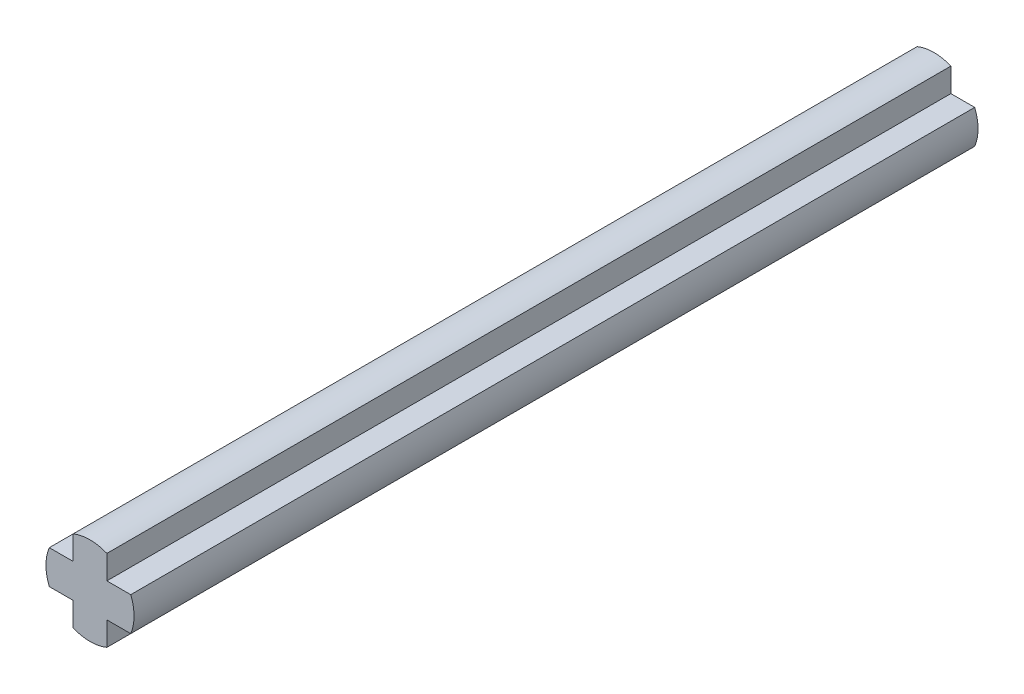
ISO-10303-21;
HEADER;
FILE_DESCRIPTION(('STEP AP214'),'2;1');
FILE_NAME('part.step','',(''),(''),'','','');
FILE_SCHEMA(('AUTOMOTIVE_DESIGN { 1 0 10303 214 1 1 1 1 }'));
ENDSEC;
DATA;
#1=APPLICATION_CONTEXT('core data for automotive mechanical design processes');
#2=APPLICATION_PROTOCOL_DEFINITION('international standard','automotive_design',2000,#1);
#3=PRODUCT_CONTEXT('',#1,'mechanical');
#4=PRODUCT('Part','Part','',(#3));
#5=PRODUCT_RELATED_PRODUCT_CATEGORY('part','',(#4));
#6=PRODUCT_DEFINITION_FORMATION('','',#4);
#7=PRODUCT_DEFINITION_CONTEXT('part definition',#1,'design');
#8=PRODUCT_DEFINITION('design','',#6,#7);
#9=PRODUCT_DEFINITION_SHAPE('','',#8);
#10=(LENGTH_UNIT() NAMED_UNIT(*) SI_UNIT(.MILLI.,.METRE.));
#11=(NAMED_UNIT(*) PLANE_ANGLE_UNIT() SI_UNIT($,.RADIAN.));
#12=(NAMED_UNIT(*) SI_UNIT($,.STERADIAN.) SOLID_ANGLE_UNIT());
#13=UNCERTAINTY_MEASURE_WITH_UNIT(LENGTH_MEASURE(1.E-05),#10,'distance_accuracy_value','');
#14=(GEOMETRIC_REPRESENTATION_CONTEXT(3) GLOBAL_UNCERTAINTY_ASSIGNED_CONTEXT((#13)) GLOBAL_UNIT_ASSIGNED_CONTEXT((#10,
#11,#12)) REPRESENTATION_CONTEXT('',''));
#15=CARTESIAN_POINT('',(0.,0.,0.));
#16=DIRECTION('',(0.,0.,1.));
#17=DIRECTION('',(1.,0.,0.));
#18=AXIS2_PLACEMENT_3D('',#15,#16,#17);
#19=CARTESIAN_POINT('',(-2.17082933460924,0.9,45.));
#20=DIRECTION('',(0.,-1.,0.));
#21=DIRECTION('',(0.,0.,-1.));
#22=AXIS2_PLACEMENT_3D('',#19,#20,#21);
#23=PLANE('',#22);
#24=DIRECTION('',(-1.,0.,0.));
#25=VECTOR('',#24,1.);
#26=CARTESIAN_POINT('',(-2.17082933460924,0.9,0.));
#27=LINE('',#26,#25);
#28=CARTESIAN_POINT('',(-0.9,0.9,0.));
#29=VERTEX_POINT('',#28);
#30=CARTESIAN_POINT('',(-2.17082933460924,0.9,0.));
#31=VERTEX_POINT('',#30);
#32=EDGE_CURVE('E153',#29,#31,#27,.T.);
#33=ORIENTED_EDGE('',*,*,#32,.T.);
#34=DIRECTION('',(0.,0.,-1.));
#35=VECTOR('',#34,1.);
#36=CARTESIAN_POINT('',(-2.17082933460924,0.9,45.));
#37=LINE('',#36,#35);
#38=CARTESIAN_POINT('',(-2.17082933460924,0.9,45.));
#39=VERTEX_POINT('',#38);
#40=EDGE_CURVE('E11',#39,#31,#37,.T.);
#41=ORIENTED_EDGE('',*,*,#40,.F.);
#42=DIRECTION('',(-1.,0.,0.));
#43=VECTOR('',#42,1.);
#44=CARTESIAN_POINT('',(-2.17082933460924,0.9,45.));
#45=LINE('',#44,#43);
#46=CARTESIAN_POINT('',(-0.9,0.9,45.));
#47=VERTEX_POINT('',#46);
#48=EDGE_CURVE('E175',#47,#39,#45,.T.);
#49=ORIENTED_EDGE('',*,*,#48,.F.);
#50=DIRECTION('',(0.,0.,-1.));
#51=VECTOR('',#50,1.);
#52=CARTESIAN_POINT('',(-0.9,0.9,45.));
#53=LINE('',#52,#51);
#54=EDGE_CURVE('E149',#47,#29,#53,.T.);
#55=ORIENTED_EDGE('',*,*,#54,.T.);
#56=EDGE_LOOP('',(#33,#41,#49,#55));
#57=FACE_BOUND('',#56,.T.);
#58=ADVANCED_FACE('F33',(#57),#23,.F.);
#59=CARTESIAN_POINT('',(0.,0.,45.));
#60=DIRECTION('',(0.,0.,-1.));
#61=DIRECTION('',(-1.,0.,0.));
#62=AXIS2_PLACEMENT_3D('',#59,#60,#61);
#63=CYLINDRICAL_SURFACE('',#62,2.35);
#64=CARTESIAN_POINT('',(0.,0.,0.));
#65=DIRECTION('',(0.,0.,1.));
#66=DIRECTION('',(1.,0.,0.));
#67=AXIS2_PLACEMENT_3D('',#64,#65,#66);
#68=CIRCLE('',#67,2.35);
#69=CARTESIAN_POINT('',(-2.17082933460924,-0.9,0.));
#70=VERTEX_POINT('',#69);
#71=EDGE_CURVE('E156',#31,#70,#68,.T.);
#72=ORIENTED_EDGE('',*,*,#71,.T.);
#73=DIRECTION('',(0.,0.,-1.));
#74=VECTOR('',#73,1.);
#75=CARTESIAN_POINT('',(-2.17082933460924,-0.9,45.));
#76=LINE('',#75,#74);
#77=CARTESIAN_POINT('',(-2.17082933460924,-0.9,45.));
#78=VERTEX_POINT('',#77);
#79=EDGE_CURVE('E41',#78,#70,#76,.T.);
#80=ORIENTED_EDGE('',*,*,#79,.F.);
#81=CARTESIAN_POINT('',(0.,0.,45.));
#82=DIRECTION('',(0.,0.,1.));
#83=DIRECTION('',(1.,0.,0.));
#84=AXIS2_PLACEMENT_3D('',#81,#82,#83);
#85=CIRCLE('',#84,2.35);
#86=EDGE_CURVE('E104',#39,#78,#85,.T.);
#87=ORIENTED_EDGE('',*,*,#86,.F.);
#88=ORIENTED_EDGE('',*,*,#40,.T.);
#89=EDGE_LOOP('',(#72,#80,#87,#88));
#90=FACE_BOUND('',#89,.T.);
#91=ADVANCED_FACE('F253',(#90),#63,.T.);
#92=CARTESIAN_POINT('',(-2.17082933460924,-0.9,45.));
#93=DIRECTION('',(0.,1.,0.));
#94=DIRECTION('',(-1.,0.,0.));
#95=AXIS2_PLACEMENT_3D('',#92,#93,#94);
#96=PLANE('',#95);
#97=DIRECTION('',(1.,0.,0.));
#98=VECTOR('',#97,1.);
#99=CARTESIAN_POINT('',(-2.17082933460924,-0.9,0.));
#100=LINE('',#99,#98);
#101=CARTESIAN_POINT('',(-0.9,-0.9,0.));
#102=VERTEX_POINT('',#101);
#103=EDGE_CURVE('E158',#70,#102,#100,.T.);
#104=ORIENTED_EDGE('',*,*,#103,.T.);
#105=DIRECTION('',(0.,0.,-1.));
#106=VECTOR('',#105,1.);
#107=CARTESIAN_POINT('',(-0.9,-0.9,45.));
#108=LINE('',#107,#106);
#109=CARTESIAN_POINT('',(-0.9,-0.9,45.));
#110=VERTEX_POINT('',#109);
#111=EDGE_CURVE('E194',#110,#102,#108,.T.);
#112=ORIENTED_EDGE('',*,*,#111,.F.);
#113=DIRECTION('',(1.,0.,0.));
#114=VECTOR('',#113,1.);
#115=CARTESIAN_POINT('',(-2.17082933460924,-0.9,45.));
#116=LINE('',#115,#114);
#117=EDGE_CURVE('E202',#78,#110,#116,.T.);
#118=ORIENTED_EDGE('',*,*,#117,.F.);
#119=ORIENTED_EDGE('',*,*,#79,.T.);
#120=EDGE_LOOP('',(#104,#112,#118,#119));
#121=FACE_BOUND('',#120,.T.);
#122=ADVANCED_FACE('F200',(#121),#96,.F.);
#123=CARTESIAN_POINT('',(-0.9,-0.9,45.));
#124=DIRECTION('',(1.,0.,0.));
#125=DIRECTION('',(0.,1.,0.));
#126=AXIS2_PLACEMENT_3D('',#123,#124,#125);
#127=PLANE('',#126);
#128=DIRECTION('',(0.,-1.,0.));
#129=VECTOR('',#128,1.);
#130=CARTESIAN_POINT('',(-0.9,-0.9,0.));
#131=LINE('',#130,#129);
#132=CARTESIAN_POINT('',(-0.900000000000001,-2.17082933460924,0.));
#133=VERTEX_POINT('',#132);
#134=EDGE_CURVE('E160',#102,#133,#131,.T.);
#135=ORIENTED_EDGE('',*,*,#134,.T.);
#136=DIRECTION('',(0.,0.,-1.));
#137=VECTOR('',#136,1.);
#138=CARTESIAN_POINT('',(-0.900000000000001,-2.17082933460924,45.));
#139=LINE('',#138,#137);
#140=CARTESIAN_POINT('',(-0.900000000000001,-2.17082933460924,45.));
#141=VERTEX_POINT('',#140);
#142=EDGE_CURVE('E191',#141,#133,#139,.T.);
#143=ORIENTED_EDGE('',*,*,#142,.F.);
#144=DIRECTION('',(0.,-1.,0.));
#145=VECTOR('',#144,1.);
#146=CARTESIAN_POINT('',(-0.9,-0.9,45.));
#147=LINE('',#146,#145);
#148=EDGE_CURVE('E220',#110,#141,#147,.T.);
#149=ORIENTED_EDGE('',*,*,#148,.F.);
#150=ORIENTED_EDGE('',*,*,#111,.T.);
#151=EDGE_LOOP('',(#135,#143,#149,#150));
#152=FACE_BOUND('',#151,.T.);
#153=ADVANCED_FACE('F211',(#152),#127,.F.);
#154=CARTESIAN_POINT('',(0.,0.,45.));
#155=DIRECTION('',(0.,0.,-1.));
#156=DIRECTION('',(-1.,0.,0.));
#157=AXIS2_PLACEMENT_3D('',#154,#155,#156);
#158=CYLINDRICAL_SURFACE('',#157,2.35);
#159=CARTESIAN_POINT('',(0.,0.,0.));
#160=DIRECTION('',(0.,0.,1.));
#161=DIRECTION('',(1.,0.,0.));
#162=AXIS2_PLACEMENT_3D('',#159,#160,#161);
#163=CIRCLE('',#162,2.35);
#164=CARTESIAN_POINT('',(0.9,-2.17082933460924,0.));
#165=VERTEX_POINT('',#164);
#166=EDGE_CURVE('E162',#133,#165,#163,.T.);
#167=ORIENTED_EDGE('',*,*,#166,.T.);
#168=DIRECTION('',(0.,0.,-1.));
#169=VECTOR('',#168,1.);
#170=CARTESIAN_POINT('',(0.9,-2.17082933460924,45.));
#171=LINE('',#170,#169);
#172=CARTESIAN_POINT('',(0.9,-2.17082933460924,45.));
#173=VERTEX_POINT('',#172);
#174=EDGE_CURVE('E188',#173,#165,#171,.T.);
#175=ORIENTED_EDGE('',*,*,#174,.F.);
#176=CARTESIAN_POINT('',(0.,0.,45.));
#177=DIRECTION('',(0.,0.,1.));
#178=DIRECTION('',(1.,0.,0.));
#179=AXIS2_PLACEMENT_3D('',#176,#177,#178);
#180=CIRCLE('',#179,2.35);
#181=EDGE_CURVE('E217',#141,#173,#180,.T.);
#182=ORIENTED_EDGE('',*,*,#181,.F.);
#183=ORIENTED_EDGE('',*,*,#142,.T.);
#184=EDGE_LOOP('',(#167,#175,#182,#183));
#185=FACE_BOUND('',#184,.T.);
#186=ADVANCED_FACE('F215',(#185),#158,.T.);
#187=CARTESIAN_POINT('',(0.9,-0.9,45.));
#188=DIRECTION('',(-1.,0.,0.));
#189=DIRECTION('',(0.,-1.,0.));
#190=AXIS2_PLACEMENT_3D('',#187,#188,#189);
#191=PLANE('',#190);
#192=DIRECTION('',(0.,1.,0.));
#193=VECTOR('',#192,1.);
#194=CARTESIAN_POINT('',(0.9,-0.9,0.));
#195=LINE('',#194,#193);
#196=CARTESIAN_POINT('',(0.9,-0.9,0.));
#197=VERTEX_POINT('',#196);
#198=EDGE_CURVE('E164',#165,#197,#195,.T.);
#199=ORIENTED_EDGE('',*,*,#198,.T.);
#200=DIRECTION('',(0.,0.,-1.));
#201=VECTOR('',#200,1.);
#202=CARTESIAN_POINT('',(0.9,-0.9,45.));
#203=LINE('',#202,#201);
#204=CARTESIAN_POINT('',(0.9,-0.9,45.));
#205=VERTEX_POINT('',#204);
#206=EDGE_CURVE('E185',#205,#197,#203,.T.);
#207=ORIENTED_EDGE('',*,*,#206,.F.);
#208=DIRECTION('',(0.,1.,0.));
#209=VECTOR('',#208,1.);
#210=CARTESIAN_POINT('',(0.9,-0.9,45.));
#211=LINE('',#210,#209);
#212=EDGE_CURVE('E219',#173,#205,#211,.T.);
#213=ORIENTED_EDGE('',*,*,#212,.F.);
#214=ORIENTED_EDGE('',*,*,#174,.T.);
#215=EDGE_LOOP('',(#199,#207,#213,#214));
#216=FACE_BOUND('',#215,.T.);
#217=ADVANCED_FACE('F266',(#216),#191,.F.);
#218=CARTESIAN_POINT('',(0.9,-0.9,45.));
#219=DIRECTION('',(0.,1.,0.));
#220=DIRECTION('',(-1.,0.,0.));
#221=AXIS2_PLACEMENT_3D('',#218,#219,#220);
#222=PLANE('',#221);
#223=DIRECTION('',(1.,0.,0.));
#224=VECTOR('',#223,1.);
#225=CARTESIAN_POINT('',(0.9,-0.9,0.));
#226=LINE('',#225,#224);
#227=CARTESIAN_POINT('',(2.17082933460924,-0.900000000000001,0.));
#228=VERTEX_POINT('',#227);
#229=EDGE_CURVE('E166',#197,#228,#226,.T.);
#230=ORIENTED_EDGE('',*,*,#229,.T.);
#231=DIRECTION('',(0.,0.,-1.));
#232=VECTOR('',#231,1.);
#233=CARTESIAN_POINT('',(2.17082933460924,-0.900000000000001,45.));
#234=LINE('',#233,#232);
#235=CARTESIAN_POINT('',(2.17082933460924,-0.900000000000001,45.));
#236=VERTEX_POINT('',#235);
#237=EDGE_CURVE('E182',#236,#228,#234,.T.);
#238=ORIENTED_EDGE('',*,*,#237,.F.);
#239=DIRECTION('',(1.,0.,0.));
#240=VECTOR('',#239,1.);
#241=CARTESIAN_POINT('',(0.9,-0.9,45.));
#242=LINE('',#241,#240);
#243=EDGE_CURVE('E222',#205,#236,#242,.T.);
#244=ORIENTED_EDGE('',*,*,#243,.F.);
#245=ORIENTED_EDGE('',*,*,#206,.T.);
#246=EDGE_LOOP('',(#230,#238,#244,#245));
#247=FACE_BOUND('',#246,.T.);
#248=ADVANCED_FACE('F269',(#247),#222,.F.);
#249=CARTESIAN_POINT('',(0.,0.,45.));
#250=DIRECTION('',(0.,0.,-1.));
#251=DIRECTION('',(-1.,0.,0.));
#252=AXIS2_PLACEMENT_3D('',#249,#250,#251);
#253=CYLINDRICAL_SURFACE('',#252,2.35);
#254=CARTESIAN_POINT('',(0.,0.,0.));
#255=DIRECTION('',(0.,0.,1.));
#256=DIRECTION('',(1.,0.,0.));
#257=AXIS2_PLACEMENT_3D('',#254,#255,#256);
#258=CIRCLE('',#257,2.35);
#259=CARTESIAN_POINT('',(2.17082933460924,0.9,0.));
#260=VERTEX_POINT('',#259);
#261=EDGE_CURVE('E168',#228,#260,#258,.T.);
#262=ORIENTED_EDGE('',*,*,#261,.T.);
#263=DIRECTION('',(0.,0.,-1.));
#264=VECTOR('',#263,1.);
#265=CARTESIAN_POINT('',(2.17082933460924,0.9,45.));
#266=LINE('',#265,#264);
#267=CARTESIAN_POINT('',(2.17082933460924,0.9,45.));
#268=VERTEX_POINT('',#267);
#269=EDGE_CURVE('E179',#268,#260,#266,.T.);
#270=ORIENTED_EDGE('',*,*,#269,.F.);
#271=CARTESIAN_POINT('',(0.,0.,45.));
#272=DIRECTION('',(0.,0.,1.));
#273=DIRECTION('',(1.,0.,0.));
#274=AXIS2_PLACEMENT_3D('',#271,#272,#273);
#275=CIRCLE('',#274,2.35);
#276=EDGE_CURVE('E228',#236,#268,#275,.T.);
#277=ORIENTED_EDGE('',*,*,#276,.F.);
#278=ORIENTED_EDGE('',*,*,#237,.T.);
#279=EDGE_LOOP('',(#262,#270,#277,#278));
#280=FACE_BOUND('',#279,.T.);
#281=ADVANCED_FACE('F234',(#280),#253,.T.);
#282=CARTESIAN_POINT('',(0.9,0.9,45.));
#283=DIRECTION('',(0.,-1.,0.));
#284=DIRECTION('',(0.,0.,-1.));
#285=AXIS2_PLACEMENT_3D('',#282,#283,#284);
#286=PLANE('',#285);
#287=DIRECTION('',(-1.,0.,0.));
#288=VECTOR('',#287,1.);
#289=CARTESIAN_POINT('',(0.9,0.9,0.));
#290=LINE('',#289,#288);
#291=CARTESIAN_POINT('',(0.9,0.9,0.));
#292=VERTEX_POINT('',#291);
#293=EDGE_CURVE('E170',#260,#292,#290,.T.);
#294=ORIENTED_EDGE('',*,*,#293,.T.);
#295=DIRECTION('',(0.,0.,-1.));
#296=VECTOR('',#295,1.);
#297=CARTESIAN_POINT('',(0.9,0.9,45.));
#298=LINE('',#297,#296);
#299=CARTESIAN_POINT('',(0.9,0.9,45.));
#300=VERTEX_POINT('',#299);
#301=EDGE_CURVE('E144',#300,#292,#298,.T.);
#302=ORIENTED_EDGE('',*,*,#301,.F.);
#303=DIRECTION('',(-1.,0.,0.));
#304=VECTOR('',#303,1.);
#305=CARTESIAN_POINT('',(0.9,0.9,45.));
#306=LINE('',#305,#304);
#307=EDGE_CURVE('E135',#268,#300,#306,.T.);
#308=ORIENTED_EDGE('',*,*,#307,.F.);
#309=ORIENTED_EDGE('',*,*,#269,.T.);
#310=EDGE_LOOP('',(#294,#302,#308,#309));
#311=FACE_BOUND('',#310,.T.);
#312=ADVANCED_FACE('F238',(#311),#286,.F.);
#313=CARTESIAN_POINT('',(0.9,2.17082933460924,45.));
#314=DIRECTION('',(-1.,0.,0.));
#315=DIRECTION('',(0.,-1.,0.));
#316=AXIS2_PLACEMENT_3D('',#313,#314,#315);
#317=PLANE('',#316);
#318=DIRECTION('',(0.,1.,0.));
#319=VECTOR('',#318,1.);
#320=CARTESIAN_POINT('',(0.9,2.17082933460924,0.));
#321=LINE('',#320,#319);
#322=CARTESIAN_POINT('',(0.9,2.17082933460924,0.));
#323=VERTEX_POINT('',#322);
#324=EDGE_CURVE('E143',#292,#323,#321,.T.);
#325=ORIENTED_EDGE('',*,*,#324,.T.);
#326=DIRECTION('',(0.,0.,-1.));
#327=VECTOR('',#326,1.);
#328=CARTESIAN_POINT('',(0.9,2.17082933460924,45.));
#329=LINE('',#328,#327);
#330=CARTESIAN_POINT('',(0.9,2.17082933460924,45.));
#331=VERTEX_POINT('',#330);
#332=EDGE_CURVE('E140',#331,#323,#329,.T.);
#333=ORIENTED_EDGE('',*,*,#332,.F.);
#334=DIRECTION('',(0.,1.,0.));
#335=VECTOR('',#334,1.);
#336=CARTESIAN_POINT('',(0.9,2.17082933460924,45.));
#337=LINE('',#336,#335);
#338=EDGE_CURVE('E129',#300,#331,#337,.T.);
#339=ORIENTED_EDGE('',*,*,#338,.F.);
#340=ORIENTED_EDGE('',*,*,#301,.T.);
#341=EDGE_LOOP('',(#325,#333,#339,#340));
#342=FACE_BOUND('',#341,.T.);
#343=ADVANCED_FACE('F141',(#342),#317,.F.);
#344=CARTESIAN_POINT('',(0.,0.,45.));
#345=DIRECTION('',(0.,0.,-1.));
#346=DIRECTION('',(-1.,0.,0.));
#347=AXIS2_PLACEMENT_3D('',#344,#345,#346);
#348=CYLINDRICAL_SURFACE('',#347,2.35);
#349=CARTESIAN_POINT('',(0.,0.,0.));
#350=DIRECTION('',(0.,0.,1.));
#351=DIRECTION('',(1.,0.,0.));
#352=AXIS2_PLACEMENT_3D('',#349,#350,#351);
#353=CIRCLE('',#352,2.35);
#354=CARTESIAN_POINT('',(-0.9,2.17082933460924,0.));
#355=VERTEX_POINT('',#354);
#356=EDGE_CURVE('E90',#323,#355,#353,.T.);
#357=ORIENTED_EDGE('',*,*,#356,.T.);
#358=DIRECTION('',(0.,0.,-1.));
#359=VECTOR('',#358,1.);
#360=CARTESIAN_POINT('',(-0.9,2.17082933460924,45.));
#361=LINE('',#360,#359);
#362=CARTESIAN_POINT('',(-0.9,2.17082933460924,45.));
#363=VERTEX_POINT('',#362);
#364=EDGE_CURVE('E145',#363,#355,#361,.T.);
#365=ORIENTED_EDGE('',*,*,#364,.F.);
#366=CARTESIAN_POINT('',(0.,0.,45.));
#367=DIRECTION('',(0.,0.,1.));
#368=DIRECTION('',(1.,0.,0.));
#369=AXIS2_PLACEMENT_3D('',#366,#367,#368);
#370=CIRCLE('',#369,2.35);
#371=EDGE_CURVE('E133',#331,#363,#370,.T.);
#372=ORIENTED_EDGE('',*,*,#371,.F.);
#373=ORIENTED_EDGE('',*,*,#332,.T.);
#374=EDGE_LOOP('',(#357,#365,#372,#373));
#375=FACE_BOUND('',#374,.T.);
#376=ADVANCED_FACE('F147',(#375),#348,.T.);
#377=CARTESIAN_POINT('',(-0.9,2.17082933460924,45.));
#378=DIRECTION('',(1.,0.,0.));
#379=DIRECTION('',(0.,1.,0.));
#380=AXIS2_PLACEMENT_3D('',#377,#378,#379);
#381=PLANE('',#380);
#382=DIRECTION('',(0.,-1.,0.));
#383=VECTOR('',#382,1.);
#384=CARTESIAN_POINT('',(-0.9,2.17082933460924,0.));
#385=LINE('',#384,#383);
#386=EDGE_CURVE('E96',#355,#29,#385,.T.);
#387=ORIENTED_EDGE('',*,*,#386,.T.);
#388=ORIENTED_EDGE('',*,*,#54,.F.);
#389=DIRECTION('',(0.,-1.,0.));
#390=VECTOR('',#389,1.);
#391=CARTESIAN_POINT('',(-0.9,2.17082933460924,45.));
#392=LINE('',#391,#390);
#393=EDGE_CURVE('E49',#363,#47,#392,.T.);
#394=ORIENTED_EDGE('',*,*,#393,.F.);
#395=ORIENTED_EDGE('',*,*,#364,.T.);
#396=EDGE_LOOP('',(#387,#388,#394,#395));
#397=FACE_BOUND('',#396,.T.);
#398=ADVANCED_FACE('F242',(#397),#381,.F.);
#399=CARTESIAN_POINT('',(0.,0.,45.));
#400=DIRECTION('',(0.,0.,1.));
#401=DIRECTION('',(1.,0.,0.));
#402=AXIS2_PLACEMENT_3D('',#399,#400,#401);
#403=PLANE('',#402);
#404=ORIENTED_EDGE('',*,*,#48,.T.);
#405=ORIENTED_EDGE('',*,*,#86,.T.);
#406=ORIENTED_EDGE('',*,*,#117,.T.);
#407=ORIENTED_EDGE('',*,*,#148,.T.);
#408=ORIENTED_EDGE('',*,*,#181,.T.);
#409=ORIENTED_EDGE('',*,*,#212,.T.);
#410=ORIENTED_EDGE('',*,*,#243,.T.);
#411=ORIENTED_EDGE('',*,*,#276,.T.);
#412=ORIENTED_EDGE('',*,*,#307,.T.);
#413=ORIENTED_EDGE('',*,*,#338,.T.);
#414=ORIENTED_EDGE('',*,*,#371,.T.);
#415=ORIENTED_EDGE('',*,*,#393,.T.);
#416=EDGE_LOOP('',(#404,#405,#406,#407,#408,#409,#410,#411,#412,#413,#414,#415));
#417=FACE_BOUND('',#416,.T.);
#418=ADVANCED_FACE('F131',(#417),#403,.T.);
#419=CARTESIAN_POINT('',(0.,0.,0.));
#420=DIRECTION('',(0.,0.,1.));
#421=DIRECTION('',(1.,0.,0.));
#422=AXIS2_PLACEMENT_3D('',#419,#420,#421);
#423=PLANE('',#422);
#424=ORIENTED_EDGE('',*,*,#32,.F.);
#425=ORIENTED_EDGE('',*,*,#386,.F.);
#426=ORIENTED_EDGE('',*,*,#356,.F.);
#427=ORIENTED_EDGE('',*,*,#324,.F.);
#428=ORIENTED_EDGE('',*,*,#293,.F.);
#429=ORIENTED_EDGE('',*,*,#261,.F.);
#430=ORIENTED_EDGE('',*,*,#229,.F.);
#431=ORIENTED_EDGE('',*,*,#198,.F.);
#432=ORIENTED_EDGE('',*,*,#166,.F.);
#433=ORIENTED_EDGE('',*,*,#134,.F.);
#434=ORIENTED_EDGE('',*,*,#103,.F.);
#435=ORIENTED_EDGE('',*,*,#71,.F.);
#436=EDGE_LOOP('',(#424,#425,#426,#427,#428,#429,#430,#431,#432,#433,#434,#435));
#437=FACE_BOUND('',#436,.T.);
#438=ADVANCED_FACE('F206',(#437),#423,.F.);
#439=CLOSED_SHELL('',(#58,#91,#122,#153,#186,#217,#248,#281,#312,#343,#376,#398,#418,#438));
#440=MANIFOLD_SOLID_BREP('B2',#439);
#441=ADVANCED_BREP_SHAPE_REPRESENTATION('',(#18,#440),#14);
#442=SHAPE_DEFINITION_REPRESENTATION(#9,#441);
ENDSEC;
END-ISO-10303-21;
